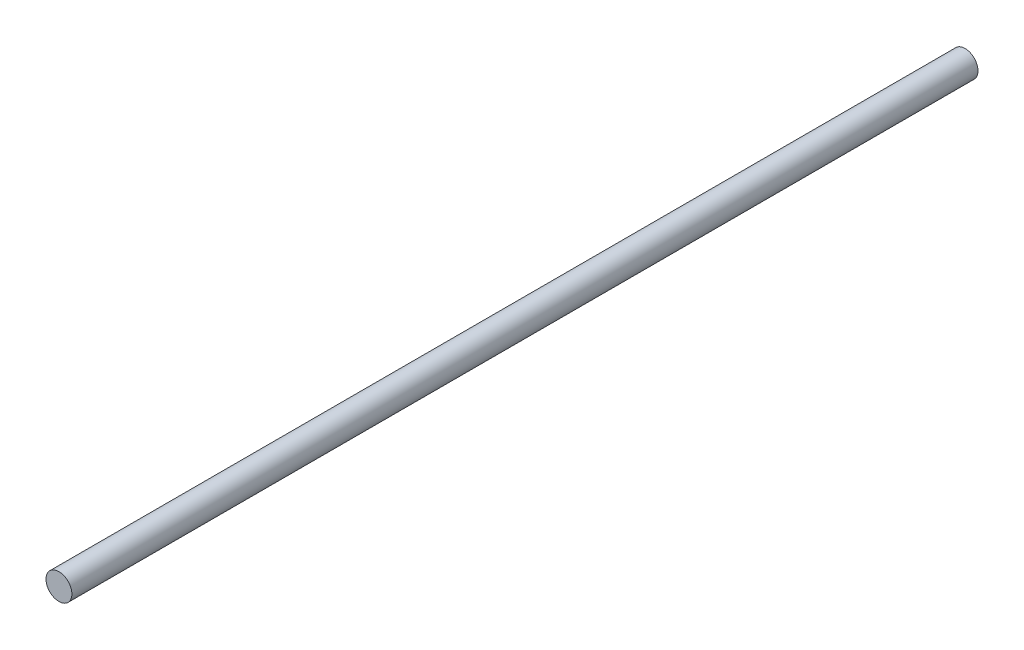
ISO-10303-21;
HEADER;
FILE_DESCRIPTION(('STEP AP214'),'2;1');
FILE_NAME('part.step','',(''),(''),'','','');
FILE_SCHEMA(('AUTOMOTIVE_DESIGN { 1 0 10303 214 1 1 1 1 }'));
ENDSEC;
DATA;
#1=APPLICATION_CONTEXT('core data for automotive mechanical design processes');
#2=APPLICATION_PROTOCOL_DEFINITION('international standard','automotive_design',2000,#1);
#3=PRODUCT_CONTEXT('',#1,'mechanical');
#4=PRODUCT('Part','Part','',(#3));
#5=PRODUCT_RELATED_PRODUCT_CATEGORY('part','',(#4));
#6=PRODUCT_DEFINITION_FORMATION('','',#4);
#7=PRODUCT_DEFINITION_CONTEXT('part definition',#1,'design');
#8=PRODUCT_DEFINITION('design','',#6,#7);
#9=PRODUCT_DEFINITION_SHAPE('','',#8);
#10=(LENGTH_UNIT() NAMED_UNIT(*) SI_UNIT(.MILLI.,.METRE.));
#11=(NAMED_UNIT(*) PLANE_ANGLE_UNIT() SI_UNIT($,.RADIAN.));
#12=(NAMED_UNIT(*) SI_UNIT($,.STERADIAN.) SOLID_ANGLE_UNIT());
#13=UNCERTAINTY_MEASURE_WITH_UNIT(LENGTH_MEASURE(1.E-05),#10,'distance_accuracy_value','');
#14=(GEOMETRIC_REPRESENTATION_CONTEXT(3) GLOBAL_UNCERTAINTY_ASSIGNED_CONTEXT((#13)) GLOBAL_UNIT_ASSIGNED_CONTEXT((#10,
#11,#12)) REPRESENTATION_CONTEXT('',''));
#15=CARTESIAN_POINT('',(0.,0.,0.));
#16=DIRECTION('',(0.,0.,1.));
#17=DIRECTION('',(1.,0.,0.));
#18=AXIS2_PLACEMENT_3D('',#15,#16,#17);
#19=CARTESIAN_POINT('',(0.,0.,280.));
#20=DIRECTION('',(0.,0.,-1.));
#21=DIRECTION('',(-1.,0.,0.));
#22=AXIS2_PLACEMENT_3D('',#19,#20,#21);
#23=CYLINDRICAL_SURFACE('',#22,4.);
#24=CARTESIAN_POINT('',(0.,0.,280.));
#25=DIRECTION('',(0.,0.,1.));
#26=DIRECTION('',(1.,0.,0.));
#27=AXIS2_PLACEMENT_3D('',#24,#25,#26);
#28=CIRCLE('',#27,4.);
#29=CARTESIAN_POINT('',(4.,0.,280.));
#30=VERTEX_POINT('',#29);
#31=EDGE_CURVE('E10',#30,#30,#28,.T.);
#32=ORIENTED_EDGE('',*,*,#31,.F.);
#33=EDGE_LOOP('',(#32));
#34=FACE_BOUND('',#33,.T.);
#35=CARTESIAN_POINT('',(0.,0.,0.));
#36=DIRECTION('',(0.,0.,1.));
#37=DIRECTION('',(1.,0.,0.));
#38=AXIS2_PLACEMENT_3D('',#35,#36,#37);
#39=CIRCLE('',#38,4.);
#40=CARTESIAN_POINT('',(4.,0.,0.));
#41=VERTEX_POINT('',#40);
#42=EDGE_CURVE('E33',#41,#41,#39,.T.);
#43=ORIENTED_EDGE('',*,*,#42,.T.);
#44=EDGE_LOOP('',(#43));
#45=FACE_BOUND('',#44,.T.);
#46=ADVANCED_FACE('F30',(#34,#45),#23,.T.);
#47=CARTESIAN_POINT('',(0.,0.,280.));
#48=DIRECTION('',(0.,0.,1.));
#49=DIRECTION('',(1.,0.,0.));
#50=AXIS2_PLACEMENT_3D('',#47,#48,#49);
#51=PLANE('',#50);
#52=ORIENTED_EDGE('',*,*,#31,.T.);
#53=EDGE_LOOP('',(#52));
#54=FACE_BOUND('',#53,.T.);
#55=ADVANCED_FACE('F45',(#54),#51,.T.);
#56=CARTESIAN_POINT('',(0.,0.,0.));
#57=DIRECTION('',(0.,0.,1.));
#58=DIRECTION('',(1.,0.,0.));
#59=AXIS2_PLACEMENT_3D('',#56,#57,#58);
#60=PLANE('',#59);
#61=ORIENTED_EDGE('',*,*,#42,.F.);
#62=EDGE_LOOP('',(#61));
#63=FACE_BOUND('',#62,.T.);
#64=ADVANCED_FACE('F43',(#63),#60,.F.);
#65=CLOSED_SHELL('',(#46,#55,#64));
#66=MANIFOLD_SOLID_BREP('B2',#65);
#67=ADVANCED_BREP_SHAPE_REPRESENTATION('',(#18,#66),#14);
#68=SHAPE_DEFINITION_REPRESENTATION(#9,#67);
ENDSEC;
END-ISO-10303-21;
